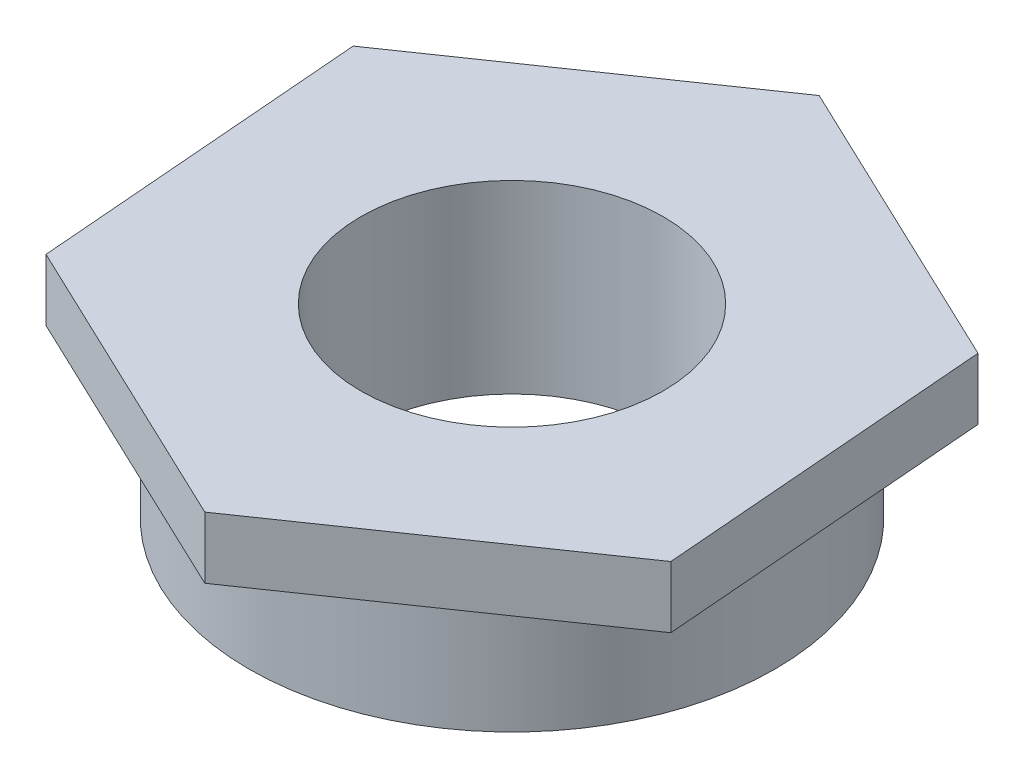
ISO-10303-21;
HEADER;
FILE_DESCRIPTION(('STEP AP214'),'2;1');
FILE_NAME('part.step','',(''),(''),'','','');
FILE_SCHEMA(('AUTOMOTIVE_DESIGN { 1 0 10303 214 1 1 1 1 }'));
ENDSEC;
DATA;
#1=APPLICATION_CONTEXT('core data for automotive mechanical design processes');
#2=APPLICATION_PROTOCOL_DEFINITION('international standard','automotive_design',2000,#1);
#3=PRODUCT_CONTEXT('',#1,'mechanical');
#4=PRODUCT('Part','Part','',(#3));
#5=PRODUCT_RELATED_PRODUCT_CATEGORY('part','',(#4));
#6=PRODUCT_DEFINITION_FORMATION('','',#4);
#7=PRODUCT_DEFINITION_CONTEXT('part definition',#1,'design');
#8=PRODUCT_DEFINITION('design','',#6,#7);
#9=PRODUCT_DEFINITION_SHAPE('','',#8);
#10=(LENGTH_UNIT() NAMED_UNIT(*) SI_UNIT(.MILLI.,.METRE.));
#11=(NAMED_UNIT(*) PLANE_ANGLE_UNIT() SI_UNIT($,.RADIAN.));
#12=(NAMED_UNIT(*) SI_UNIT($,.STERADIAN.) SOLID_ANGLE_UNIT());
#13=UNCERTAINTY_MEASURE_WITH_UNIT(LENGTH_MEASURE(1.E-05),#10,'distance_accuracy_value','');
#14=(GEOMETRIC_REPRESENTATION_CONTEXT(3) GLOBAL_UNCERTAINTY_ASSIGNED_CONTEXT((#13)) GLOBAL_UNIT_ASSIGNED_CONTEXT((#10,
#11,#12)) REPRESENTATION_CONTEXT('',''));
#15=CARTESIAN_POINT('',(0.,0.,0.));
#16=DIRECTION('',(0.,0.,1.));
#17=DIRECTION('',(1.,0.,0.));
#18=AXIS2_PLACEMENT_3D('',#15,#16,#17);
#19=CARTESIAN_POINT('',(0.221601351525087,0.51,2.76240707373158));
#20=DIRECTION('',(-0.567649318486044,0.,-0.823270460554932));
#21=DIRECTION('',(-0.823270460554932,0.,0.567649318486044));
#22=AXIS2_PLACEMENT_3D('',#19,#20,#21);
#23=PLANE('',#22);
#24=DIRECTION('',(0.823270460554932,0.,-0.567649318486044));
#25=VECTOR('',#24,1.);
#26=CARTESIAN_POINT('',(0.221601351525087,0.,2.76240707373158));
#27=LINE('',#26,#25);
#28=CARTESIAN_POINT('',(0.221601351525087,0.,2.76240707373158));
#29=VERTEX_POINT('',#28);
#30=CARTESIAN_POINT('',(2.50311537720792,0.,1.1892911369321));
#31=VERTEX_POINT('',#30);
#32=EDGE_CURVE('E130',#29,#31,#27,.T.);
#33=ORIENTED_EDGE('',*,*,#32,.T.);
#34=DIRECTION('',(0.,-1.,0.));
#35=VECTOR('',#34,1.);
#36=CARTESIAN_POINT('',(2.50311537720792,0.51,1.1892911369321));
#37=LINE('',#36,#35);
#38=CARTESIAN_POINT('',(2.50311537720792,0.51,1.1892911369321));
#39=VERTEX_POINT('',#38);
#40=EDGE_CURVE('E42',#39,#31,#37,.T.);
#41=ORIENTED_EDGE('',*,*,#40,.F.);
#42=DIRECTION('',(0.823270460554932,0.,-0.567649318486044));
#43=VECTOR('',#42,1.);
#44=CARTESIAN_POINT('',(0.221601351525087,0.51,2.76240707373158));
#45=LINE('',#44,#43);
#46=CARTESIAN_POINT('',(0.221601351525087,0.51,2.76240707373158));
#47=VERTEX_POINT('',#46);
#48=EDGE_CURVE('E147',#47,#39,#45,.T.);
#49=ORIENTED_EDGE('',*,*,#48,.F.);
#50=DIRECTION('',(0.,-1.,0.));
#51=VECTOR('',#50,1.);
#52=CARTESIAN_POINT('',(0.221601351525087,0.51,2.76240707373158));
#53=LINE('',#52,#51);
#54=EDGE_CURVE('E126',#47,#29,#53,.T.);
#55=ORIENTED_EDGE('',*,*,#54,.T.);
#56=EDGE_LOOP('',(#33,#41,#49,#55));
#57=FACE_BOUND('',#56,.T.);
#58=ADVANCED_FACE('F39',(#57),#23,.F.);
#59=CARTESIAN_POINT('',(2.50311537720792,0.51,1.1892911369321));
#60=DIRECTION('',(-0.996797792268908,0.,0.0799634999723713));
#61=DIRECTION('',(0.0799634999723713,0.,0.996797792268908));
#62=AXIS2_PLACEMENT_3D('',#59,#60,#61);
#63=PLANE('',#62);
#64=DIRECTION('',(-0.0799634999723713,0.,-0.996797792268908));
#65=VECTOR('',#64,1.);
#66=CARTESIAN_POINT('',(2.50311537720792,0.,1.1892911369321));
#67=LINE('',#66,#65);
#68=CARTESIAN_POINT('',(2.28151402568283,0.,-1.57311593679948));
#69=VERTEX_POINT('',#68);
#70=EDGE_CURVE('E134',#31,#69,#67,.T.);
#71=ORIENTED_EDGE('',*,*,#70,.T.);
#72=DIRECTION('',(0.,-1.,0.));
#73=VECTOR('',#72,1.);
#74=CARTESIAN_POINT('',(2.28151402568283,0.51,-1.57311593679948));
#75=LINE('',#74,#73);
#76=CARTESIAN_POINT('',(2.28151402568283,0.51,-1.57311593679948));
#77=VERTEX_POINT('',#76);
#78=EDGE_CURVE('E153',#77,#69,#75,.T.);
#79=ORIENTED_EDGE('',*,*,#78,.F.);
#80=DIRECTION('',(-0.0799634999723713,0.,-0.996797792268908));
#81=VECTOR('',#80,1.);
#82=CARTESIAN_POINT('',(2.50311537720792,0.51,1.1892911369321));
#83=LINE('',#82,#81);
#84=EDGE_CURVE('E95',#39,#77,#83,.T.);
#85=ORIENTED_EDGE('',*,*,#84,.F.);
#86=ORIENTED_EDGE('',*,*,#40,.T.);
#87=EDGE_LOOP('',(#71,#79,#85,#86));
#88=FACE_BOUND('',#87,.T.);
#89=ADVANCED_FACE('F160',(#88),#63,.F.);
#90=CARTESIAN_POINT('',(2.28151402568283,0.51,-1.57311593679948));
#91=DIRECTION('',(-0.429148473782864,0.,0.903233960527304));
#92=DIRECTION('',(0.903233960527304,0.,0.429148473782864));
#93=AXIS2_PLACEMENT_3D('',#90,#91,#92);
#94=PLANE('',#93);
#95=DIRECTION('',(-0.903233960527303,0.,-0.429148473782864));
#96=VECTOR('',#95,1.);
#97=CARTESIAN_POINT('',(2.28151402568283,0.,-1.57311593679948));
#98=LINE('',#97,#96);
#99=CARTESIAN_POINT('',(-0.221601351525087,0.,-2.76240707373158));
#100=VERTEX_POINT('',#99);
#101=EDGE_CURVE('E138',#69,#100,#98,.T.);
#102=ORIENTED_EDGE('',*,*,#101,.T.);
#103=DIRECTION('',(0.,-1.,0.));
#104=VECTOR('',#103,1.);
#105=CARTESIAN_POINT('',(-0.221601351525087,0.51,-2.76240707373158));
#106=LINE('',#105,#104);
#107=CARTESIAN_POINT('',(-0.221601351525087,0.51,-2.76240707373158));
#108=VERTEX_POINT('',#107);
#109=EDGE_CURVE('E119',#108,#100,#106,.T.);
#110=ORIENTED_EDGE('',*,*,#109,.F.);
#111=DIRECTION('',(-0.903233960527303,0.,-0.429148473782864));
#112=VECTOR('',#111,1.);
#113=CARTESIAN_POINT('',(2.28151402568283,0.51,-1.57311593679948));
#114=LINE('',#113,#112);
#115=EDGE_CURVE('E108',#77,#108,#114,.T.);
#116=ORIENTED_EDGE('',*,*,#115,.F.);
#117=ORIENTED_EDGE('',*,*,#78,.T.);
#118=EDGE_LOOP('',(#102,#110,#116,#117));
#119=FACE_BOUND('',#118,.T.);
#120=ADVANCED_FACE('F166',(#119),#94,.F.);
#121=CARTESIAN_POINT('',(-0.221601351525087,0.51,-2.76240707373158));
#122=DIRECTION('',(0.567649318486044,0.,0.823270460554932));
#123=DIRECTION('',(0.823270460554932,0.,-0.567649318486044));
#124=AXIS2_PLACEMENT_3D('',#121,#122,#123);
#125=PLANE('',#124);
#126=DIRECTION('',(-0.823270460554932,0.,0.567649318486044));
#127=VECTOR('',#126,1.);
#128=CARTESIAN_POINT('',(-0.221601351525087,0.,-2.76240707373158));
#129=LINE('',#128,#127);
#130=CARTESIAN_POINT('',(-2.50311537720792,0.,-1.1892911369321));
#131=VERTEX_POINT('',#130);
#132=EDGE_CURVE('E117',#100,#131,#129,.T.);
#133=ORIENTED_EDGE('',*,*,#132,.T.);
#134=DIRECTION('',(0.,-1.,0.));
#135=VECTOR('',#134,1.);
#136=CARTESIAN_POINT('',(-2.50311537720792,0.51,-1.1892911369321));
#137=LINE('',#136,#135);
#138=CARTESIAN_POINT('',(-2.50311537720792,0.51,-1.1892911369321));
#139=VERTEX_POINT('',#138);
#140=EDGE_CURVE('E114',#139,#131,#137,.T.);
#141=ORIENTED_EDGE('',*,*,#140,.F.);
#142=DIRECTION('',(-0.823270460554932,0.,0.567649318486044));
#143=VECTOR('',#142,1.);
#144=CARTESIAN_POINT('',(-0.221601351525087,0.51,-2.76240707373158));
#145=LINE('',#144,#143);
#146=EDGE_CURVE('E102',#108,#139,#145,.T.);
#147=ORIENTED_EDGE('',*,*,#146,.F.);
#148=ORIENTED_EDGE('',*,*,#109,.T.);
#149=EDGE_LOOP('',(#133,#141,#147,#148));
#150=FACE_BOUND('',#149,.T.);
#151=ADVANCED_FACE('F115',(#150),#125,.F.);
#152=CARTESIAN_POINT('',(-2.50311537720792,0.51,-1.1892911369321));
#153=DIRECTION('',(0.996797792268908,0.,-0.0799634999723711));
#154=DIRECTION('',(-0.0799634999723711,0.,-0.996797792268908));
#155=AXIS2_PLACEMENT_3D('',#152,#153,#154);
#156=PLANE('',#155);
#157=DIRECTION('',(0.0799634999723711,0.,0.996797792268908));
#158=VECTOR('',#157,1.);
#159=CARTESIAN_POINT('',(-2.50311537720792,0.,-1.1892911369321));
#160=LINE('',#159,#158);
#161=CARTESIAN_POINT('',(-2.28151402568284,0.,1.57311593679948));
#162=VERTEX_POINT('',#161);
#163=EDGE_CURVE('E80',#131,#162,#160,.T.);
#164=ORIENTED_EDGE('',*,*,#163,.T.);
#165=DIRECTION('',(0.,-1.,0.));
#166=VECTOR('',#165,1.);
#167=CARTESIAN_POINT('',(-2.28151402568284,0.51,1.57311593679948));
#168=LINE('',#167,#166);
#169=CARTESIAN_POINT('',(-2.28151402568284,0.51,1.57311593679948));
#170=VERTEX_POINT('',#169);
#171=EDGE_CURVE('E120',#170,#162,#168,.T.);
#172=ORIENTED_EDGE('',*,*,#171,.F.);
#173=DIRECTION('',(0.0799634999723711,0.,0.996797792268908));
#174=VECTOR('',#173,1.);
#175=CARTESIAN_POINT('',(-2.50311537720792,0.51,-1.1892911369321));
#176=LINE('',#175,#174);
#177=EDGE_CURVE('E106',#139,#170,#176,.T.);
#178=ORIENTED_EDGE('',*,*,#177,.F.);
#179=ORIENTED_EDGE('',*,*,#140,.T.);
#180=EDGE_LOOP('',(#164,#172,#178,#179));
#181=FACE_BOUND('',#180,.T.);
#182=ADVANCED_FACE('F122',(#181),#156,.F.);
#183=CARTESIAN_POINT('',(-2.28151402568284,0.51,1.57311593679948));
#184=DIRECTION('',(0.429148473782864,0.,-0.903233960527304));
#185=DIRECTION('',(-0.903233960527304,0.,-0.429148473782864));
#186=AXIS2_PLACEMENT_3D('',#183,#184,#185);
#187=PLANE('',#186);
#188=DIRECTION('',(0.903233960527303,0.,0.429148473782864));
#189=VECTOR('',#188,1.);
#190=CARTESIAN_POINT('',(-2.28151402568284,0.,1.57311593679948));
#191=LINE('',#190,#189);
#192=EDGE_CURVE('E86',#162,#29,#191,.T.);
#193=ORIENTED_EDGE('',*,*,#192,.T.);
#194=ORIENTED_EDGE('',*,*,#54,.F.);
#195=DIRECTION('',(0.903233960527303,0.,0.429148473782864));
#196=VECTOR('',#195,1.);
#197=CARTESIAN_POINT('',(-2.28151402568284,0.51,1.57311593679948));
#198=LINE('',#197,#196);
#199=EDGE_CURVE('E57',#170,#47,#198,.T.);
#200=ORIENTED_EDGE('',*,*,#199,.F.);
#201=ORIENTED_EDGE('',*,*,#171,.T.);
#202=EDGE_LOOP('',(#193,#194,#200,#201));
#203=FACE_BOUND('',#202,.T.);
#204=ADVANCED_FACE('F209',(#203),#187,.F.);
#205=CARTESIAN_POINT('',(0.,0.51,0.));
#206=DIRECTION('',(0.,1.,0.));
#207=DIRECTION('',(0.,0.,1.));
#208=AXIS2_PLACEMENT_3D('',#205,#206,#207);
#209=PLANE('',#208);
#210=CARTESIAN_POINT('',(0.,0.51,0.));
#211=DIRECTION('',(0.,-1.,0.));
#212=DIRECTION('',(0.,0.,-1.));
#213=AXIS2_PLACEMENT_3D('',#210,#211,#212);
#214=CIRCLE('',#213,1.25);
#215=CARTESIAN_POINT('',(0.,0.51,-1.25));
#216=VERTEX_POINT('',#215);
#217=EDGE_CURVE('E176',#216,#216,#214,.T.);
#218=ORIENTED_EDGE('',*,*,#217,.T.);
#219=EDGE_LOOP('',(#218));
#220=FACE_BOUND('',#219,.T.);
#221=ORIENTED_EDGE('',*,*,#48,.T.);
#222=ORIENTED_EDGE('',*,*,#84,.T.);
#223=ORIENTED_EDGE('',*,*,#115,.T.);
#224=ORIENTED_EDGE('',*,*,#146,.T.);
#225=ORIENTED_EDGE('',*,*,#177,.T.);
#226=ORIENTED_EDGE('',*,*,#199,.T.);
#227=EDGE_LOOP('',(#221,#222,#223,#224,#225,#226));
#228=FACE_BOUND('',#227,.T.);
#229=ADVANCED_FACE('F104',(#220,#228),#209,.T.);
#230=CARTESIAN_POINT('',(0.,0.,0.));
#231=DIRECTION('',(0.,1.,0.));
#232=DIRECTION('',(0.,0.,1.));
#233=AXIS2_PLACEMENT_3D('',#230,#231,#232);
#234=PLANE('',#233);
#235=CARTESIAN_POINT('',(0.,0.,0.));
#236=DIRECTION('',(0.,-1.,0.));
#237=DIRECTION('',(0.,0.,-1.));
#238=AXIS2_PLACEMENT_3D('',#235,#236,#237);
#239=CIRCLE('',#238,2.175);
#240=CARTESIAN_POINT('',(0.,0.,-2.175));
#241=VERTEX_POINT('',#240);
#242=EDGE_CURVE('E11',#241,#241,#239,.T.);
#243=ORIENTED_EDGE('',*,*,#242,.F.);
#244=EDGE_LOOP('',(#243));
#245=FACE_BOUND('',#244,.T.);
#246=ORIENTED_EDGE('',*,*,#32,.F.);
#247=ORIENTED_EDGE('',*,*,#192,.F.);
#248=ORIENTED_EDGE('',*,*,#163,.F.);
#249=ORIENTED_EDGE('',*,*,#132,.F.);
#250=ORIENTED_EDGE('',*,*,#101,.F.);
#251=ORIENTED_EDGE('',*,*,#70,.F.);
#252=EDGE_LOOP('',(#246,#247,#248,#249,#250,#251));
#253=FACE_BOUND('',#252,.T.);
#254=ADVANCED_FACE('F165',(#245,#253),#234,.F.);
#255=CARTESIAN_POINT('',(0.,-1.02,0.));
#256=DIRECTION('',(0.,1.,0.));
#257=DIRECTION('',(0.,0.,1.));
#258=AXIS2_PLACEMENT_3D('',#255,#256,#257);
#259=CYLINDRICAL_SURFACE('',#258,2.175);
#260=CARTESIAN_POINT('',(0.,-1.02,0.));
#261=DIRECTION('',(0.,-1.,0.));
#262=DIRECTION('',(0.,0.,-1.));
#263=AXIS2_PLACEMENT_3D('',#260,#261,#262);
#264=CIRCLE('',#263,2.175);
#265=CARTESIAN_POINT('',(0.,-1.02,-2.175));
#266=VERTEX_POINT('',#265);
#267=EDGE_CURVE('E135',#266,#266,#264,.T.);
#268=ORIENTED_EDGE('',*,*,#267,.F.);
#269=EDGE_LOOP('',(#268));
#270=FACE_BOUND('',#269,.T.);
#271=ORIENTED_EDGE('',*,*,#242,.T.);
#272=EDGE_LOOP('',(#271));
#273=FACE_BOUND('',#272,.T.);
#274=ADVANCED_FACE('F195',(#270,#273),#259,.T.);
#275=CARTESIAN_POINT('',(0.,-1.02,0.));
#276=DIRECTION('',(0.,-1.,0.));
#277=DIRECTION('',(0.,0.,-1.));
#278=AXIS2_PLACEMENT_3D('',#275,#276,#277);
#279=PLANE('',#278);
#280=CARTESIAN_POINT('',(0.,-1.02,0.));
#281=DIRECTION('',(0.,-1.,0.));
#282=DIRECTION('',(0.,0.,-1.));
#283=AXIS2_PLACEMENT_3D('',#280,#281,#282);
#284=CIRCLE('',#283,1.25);
#285=CARTESIAN_POINT('',(0.,-1.02,-1.25));
#286=VERTEX_POINT('',#285);
#287=EDGE_CURVE('E177',#286,#286,#284,.T.);
#288=ORIENTED_EDGE('',*,*,#287,.F.);
#289=EDGE_LOOP('',(#288));
#290=FACE_BOUND('',#289,.T.);
#291=ORIENTED_EDGE('',*,*,#267,.T.);
#292=EDGE_LOOP('',(#291));
#293=FACE_BOUND('',#292,.T.);
#294=ADVANCED_FACE('F189',(#290,#293),#279,.T.);
#295=CARTESIAN_POINT('',(0.,0.51,0.));
#296=DIRECTION('',(0.,-1.,0.));
#297=DIRECTION('',(0.,0.,-1.));
#298=AXIS2_PLACEMENT_3D('',#295,#296,#297);
#299=CYLINDRICAL_SURFACE('',#298,1.25);
#300=ORIENTED_EDGE('',*,*,#217,.F.);
#301=EDGE_LOOP('',(#300));
#302=FACE_BOUND('',#301,.T.);
#303=ORIENTED_EDGE('',*,*,#287,.T.);
#304=EDGE_LOOP('',(#303));
#305=FACE_BOUND('',#304,.T.);
#306=ADVANCED_FACE('F186',(#302,#305),#299,.F.);
#307=CLOSED_SHELL('',(#58,#89,#120,#151,#182,#204,#229,#254,#274,#294,#306));
#308=MANIFOLD_SOLID_BREP('B2',#307);
#309=ADVANCED_BREP_SHAPE_REPRESENTATION('',(#18,#308),#14);
#310=SHAPE_DEFINITION_REPRESENTATION(#9,#309);
ENDSEC;
END-ISO-10303-21;
